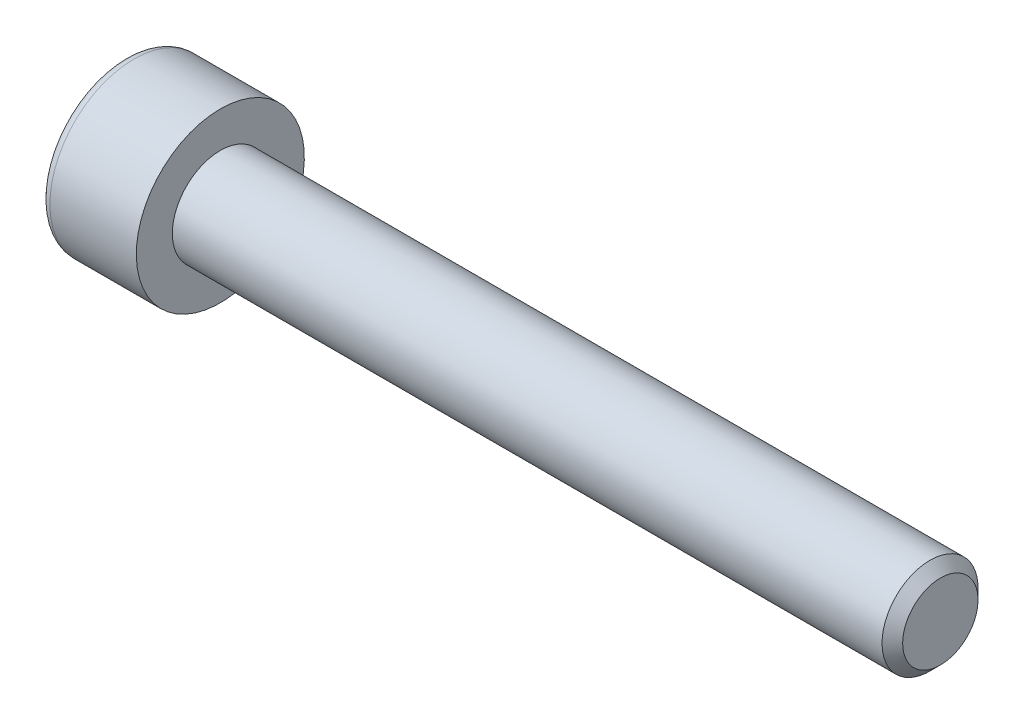
ISO-10303-21;
HEADER;
FILE_DESCRIPTION(('STEP AP214'),'2;1');
FILE_NAME('part.step','',(''),(''),'','','');
FILE_SCHEMA(('AUTOMOTIVE_DESIGN { 1 0 10303 214 1 1 1 1 }'));
ENDSEC;
DATA;
#1=APPLICATION_CONTEXT('core data for automotive mechanical design processes');
#2=APPLICATION_PROTOCOL_DEFINITION('international standard','automotive_design',2000,#1);
#3=PRODUCT_CONTEXT('',#1,'mechanical');
#4=PRODUCT('Part','Part','',(#3));
#5=PRODUCT_RELATED_PRODUCT_CATEGORY('part','',(#4));
#6=PRODUCT_DEFINITION_FORMATION('','',#4);
#7=PRODUCT_DEFINITION_CONTEXT('part definition',#1,'design');
#8=PRODUCT_DEFINITION('design','',#6,#7);
#9=PRODUCT_DEFINITION_SHAPE('','',#8);
#10=(LENGTH_UNIT() NAMED_UNIT(*) SI_UNIT(.MILLI.,.METRE.));
#11=(NAMED_UNIT(*) PLANE_ANGLE_UNIT() SI_UNIT($,.RADIAN.));
#12=(NAMED_UNIT(*) SI_UNIT($,.STERADIAN.) SOLID_ANGLE_UNIT());
#13=UNCERTAINTY_MEASURE_WITH_UNIT(LENGTH_MEASURE(1.E-05),#10,'distance_accuracy_value','');
#14=(GEOMETRIC_REPRESENTATION_CONTEXT(3) GLOBAL_UNCERTAINTY_ASSIGNED_CONTEXT((#13)) GLOBAL_UNIT_ASSIGNED_CONTEXT((#10,
#11,#12)) REPRESENTATION_CONTEXT('',''));
#15=CARTESIAN_POINT('',(0.,0.,0.));
#16=DIRECTION('',(0.,0.,1.));
#17=DIRECTION('',(1.,0.,0.));
#18=AXIS2_PLACEMENT_3D('',#15,#16,#17);
#19=CARTESIAN_POINT('',(-3.99999999999999,-1.5,0.866025403784439));
#20=DIRECTION('',(0.,-0.5,0.866025403784439));
#21=DIRECTION('',(0.,-0.866025403784439,-0.5));
#22=AXIS2_PLACEMENT_3D('',#19,#20,#21);
#23=PLANE('',#22);
#24=DIRECTION('',(1.,0.,0.));
#25=VECTOR('',#24,1.);
#26=CARTESIAN_POINT('',(-3.99999999999999,-1.5,0.866025403784438));
#27=LINE('',#26,#25);
#28=CARTESIAN_POINT('',(-1.99999998891168,-1.49999996234746,0.866025425523144));
#29=VERTEX_POINT('',#28);
#30=CARTESIAN_POINT('',(-3.99999999999999,-1.5,0.866025403784438));
#31=VERTEX_POINT('',#30);
#32=EDGE_CURVE('E80',#29,#31,#27,.F.);
#33=ORIENTED_EDGE('',*,*,#32,.T.);
#34=DIRECTION('',(0.,-0.866025403784439,-0.5));
#35=VECTOR('',#34,1.);
#36=CARTESIAN_POINT('',(-3.99999999999999,-1.5,0.866025403784439));
#37=LINE('',#36,#35);
#38=CARTESIAN_POINT('',(-3.99999999999999,0.,1.73205080756888));
#39=VERTEX_POINT('',#38);
#40=EDGE_CURVE('E92',#39,#31,#37,.T.);
#41=ORIENTED_EDGE('',*,*,#40,.F.);
#42=DIRECTION('',(1.,0.,0.));
#43=VECTOR('',#42,1.);
#44=CARTESIAN_POINT('',(-3.99999999999999,0.,1.73205080756888));
#45=LINE('',#44,#43);
#46=CARTESIAN_POINT('',(-1.99999999756033,1.17065811540061E-08,1.73205080081008));
#47=VERTEX_POINT('',#46);
#48=EDGE_CURVE('E75',#39,#47,#45,.T.);
#49=ORIENTED_EDGE('',*,*,#48,.T.);
#50=CARTESIAN_POINT('',(-2.00000000482552,-1.69656679672081E-08,1.7320507764364));
#51=CARTESIAN_POINT('',(-1.97802165673212,-0.0659159374495072,1.6939942156751));
#52=CARTESIAN_POINT('',(-1.95803350313014,-0.132400840657189,1.65560914452059));
#53=CARTESIAN_POINT('',(-1.92314478469149,-0.266521786309758,1.5781743845569));
#54=CARTESIAN_POINT('',(-1.90825656081386,-0.334160211041391,1.53912332031671));
#55=CARTESIAN_POINT('',(-1.88508196678765,-0.468598851910202,1.46150513374502));
#56=CARTESIAN_POINT('',(-1.87664133888713,-0.535378388718545,1.42294995058222));
#57=CARTESIAN_POINT('',(-1.86656687590437,-0.669251518015363,1.34565826362866));
#58=CARTESIAN_POINT('',(-1.86492469629748,-0.736344624245855,1.30692204057969));
#59=CARTESIAN_POINT('',(-1.86834972005003,-0.861700886720639,1.23454756862888));
#60=CARTESIAN_POINT('',(-1.87257596615346,-0.919982853717806,1.20089845931673));
#61=CARTESIAN_POINT('',(-1.88596797593476,-1.03616709971431,1.13381945363172));
#62=CARTESIAN_POINT('',(-1.8951383098147,-1.09406897716372,1.10038978909379));
#63=CARTESIAN_POINT('',(-1.91806236915501,-1.21049257364868,1.03317259431831));
#64=CARTESIAN_POINT('',(-1.93191322284809,-1.26899956514464,0.999393567029875));
#65=CARTESIAN_POINT('',(-1.96334880498841,-1.38514116894918,0.932339180811658));
#66=CARTESIAN_POINT('',(-1.98092615207156,-1.44277726801687,0.899062963501112));
#67=CARTESIAN_POINT('',(-1.99999997637403,-1.49999992473452,0.866025447238982));
#68=B_SPLINE_CURVE_WITH_KNOTS('',3,(#50,#51,#52,#53,#54,#55,#56,#57,#58,#59,#60,#61,#62,#63,#64,
#65,#66,#67),.UNSPECIFIED.,.F.,.F.,(4,2,2,2,2,2,2,2,4),(0.,0.237762010113592,0.476095365248652,
0.708530707821119,0.940680670780059,1.14278081102556,1.34506808914472,1.55184112923162,
1.75820836141962),.UNSPECIFIED.);
#69=EDGE_CURVE('E21',#47,#29,#68,.T.);
#70=ORIENTED_EDGE('',*,*,#69,.T.);
#71=EDGE_LOOP('',(#33,#41,#49,#70));
#72=FACE_BOUND('',#71,.T.);
#73=ADVANCED_FACE('F17',(#72),#23,.F.);
#74=CARTESIAN_POINT('',(-3.99999999999999,-1.5,-0.866025403784438));
#75=DIRECTION('',(0.,-1.,0.));
#76=DIRECTION('',(0.,0.,-1.));
#77=AXIS2_PLACEMENT_3D('',#74,#75,#76);
#78=PLANE('',#77);
#79=DIRECTION('',(1.,0.,0.));
#80=VECTOR('',#79,1.);
#81=CARTESIAN_POINT('',(-3.99999999999999,-1.5,-0.866025403784438));
#82=LINE('',#81,#80);
#83=CARTESIAN_POINT('',(-1.99999998891168,-1.5,-0.866025360307029));
#84=VERTEX_POINT('',#83);
#85=CARTESIAN_POINT('',(-3.99999999999999,-1.5,-0.866025403784438));
#86=VERTEX_POINT('',#85);
#87=EDGE_CURVE('E228',#84,#86,#82,.F.);
#88=ORIENTED_EDGE('',*,*,#87,.T.);
#89=DIRECTION('',(0.,0.,-1.));
#90=VECTOR('',#89,1.);
#91=CARTESIAN_POINT('',(-3.99999999999999,-1.5,-0.866025403784438));
#92=LINE('',#91,#90);
#93=EDGE_CURVE('E91',#31,#86,#92,.T.);
#94=ORIENTED_EDGE('',*,*,#93,.F.);
#95=ORIENTED_EDGE('',*,*,#32,.F.);
#96=CARTESIAN_POINT('',(-2.00000003345661,-1.49999996279314,0.86602543023194));
#97=CARTESIAN_POINT('',(-1.97802167633596,-1.49999998663696,0.789912288043619));
#98=CARTESIAN_POINT('',(-1.95803351798676,-1.49999999641848,0.713142136025852));
#99=CARTESIAN_POINT('',(-1.92314479392352,-1.50000000359013,0.558272606351827));
#100=CARTESIAN_POINT('',(-1.90825656917179,-1.50000000095042,0.480170477857981));
#101=CARTESIAN_POINT('',(-1.88508197259174,-1.4999999990731,0.324934102225646));
#102=CARTESIAN_POINT('',(-1.87664134301156,-1.49999999975292,0.247823733495601));
#103=CARTESIAN_POINT('',(-1.86656687719771,-1.50000000024678,0.0932403552902461));
#104=CARTESIAN_POINT('',(-1.86492469644222,-1.50000000006188,0.0157679072976017));
#105=CARTESIAN_POINT('',(-1.86834971837683,-1.49999999994613,-0.128981041441009));
#106=CARTESIAN_POINT('',(-1.87257596385187,-1.49999999998548,-0.196279262971685));
#107=CARTESIAN_POINT('',(-1.88596797287087,-1.50000000001453,-0.330437280097107));
#108=CARTESIAN_POINT('',(-1.89513830661581,-1.50000000000419,-0.397296612022104));
#109=CARTESIAN_POINT('',(-1.91806236614554,-1.49999999999572,-0.531731007509723));
#110=CARTESIAN_POINT('',(-1.93191322018681,-1.49999999999786,-0.599289065170726));
#111=CARTESIAN_POINT('',(-1.9633488034,-1.50000000000214,-0.733397843721906));
#112=CARTESIAN_POINT('',(-1.98092615120869,-1.50000000000427,-0.799950281373398));
#113=CARTESIAN_POINT('',(-1.99999997637403,-1.5,-0.866025316875355));
#114=B_SPLINE_CURVE_WITH_KNOTS('',3,(#96,#97,#98,#99,#100,#101,#102,#103,#104,#105,#106,#107,
#108,#109,#110,#111,#112,#113),.UNSPECIFIED.,.F.,.F.,(4,2,2,2,2,2,2,2,4),(0.,0.237762017435471,
0.476095379632392,0.708530728262795,0.940680697391252,1.14278084610199,1.34506813263122,
1.55184118196909,1.75820842347644),.UNSPECIFIED.);
#115=EDGE_CURVE('E85',#29,#84,#114,.T.);
#116=ORIENTED_EDGE('',*,*,#115,.T.);
#117=EDGE_LOOP('',(#88,#94,#95,#116));
#118=FACE_BOUND('',#117,.T.);
#119=ADVANCED_FACE('F89',(#118),#78,.F.);
#120=CARTESIAN_POINT('',(-3.99999999999999,0.,1.73205080756888));
#121=DIRECTION('',(0.,0.500000000000001,0.866025403784438));
#122=DIRECTION('',(0.,-0.866025403784438,0.500000000000001));
#123=AXIS2_PLACEMENT_3D('',#120,#121,#122);
#124=PLANE('',#123);
#125=ORIENTED_EDGE('',*,*,#48,.F.);
#126=DIRECTION('',(0.,-0.866025403784438,0.500000000000001));
#127=VECTOR('',#126,1.);
#128=CARTESIAN_POINT('',(-3.99999999999999,0.,1.73205080756888));
#129=LINE('',#128,#127);
#130=CARTESIAN_POINT('',(-3.99999999999999,1.5,0.866025403784437));
#131=VERTEX_POINT('',#130);
#132=EDGE_CURVE('E236',#131,#39,#129,.T.);
#133=ORIENTED_EDGE('',*,*,#132,.F.);
#134=DIRECTION('',(1.,0.,0.));
#135=VECTOR('',#134,1.);
#136=CARTESIAN_POINT('',(-3.99999999999999,1.5,0.866025403784437));
#137=LINE('',#136,#135);
#138=CARTESIAN_POINT('',(-1.99999998890538,1.5,0.866025360285225));
#139=VERTEX_POINT('',#138);
#140=EDGE_CURVE('E86',#131,#139,#137,.T.);
#141=ORIENTED_EDGE('',*,*,#140,.T.);
#142=CARTESIAN_POINT('',(-2.00000003346821,1.50000000427593,0.866025358324988));
#143=CARTESIAN_POINT('',(-1.9780216763327,1.43408410149372,0.904081950090565));
#144=CARTESIAN_POINT('',(-1.95803351797519,1.36759920447148,0.942467034585473));
#145=CARTESIAN_POINT('',(-1.92314479390271,1.23347826105346,1.01990180565832));
#146=CARTESIAN_POINT('',(-1.90825656915023,1.16583983234749,1.05895286762923));
#147=CARTESIAN_POINT('',(-1.88508197257779,1.03140118651456,1.13657105382121));
#148=CARTESIAN_POINT('',(-1.87664134300272,0.964621648655026,1.17512623876626));
#149=CARTESIAN_POINT('',(-1.86656687719568,0.830748516407823,1.25241792827708));
#150=CARTESIAN_POINT('',(-1.86492469644174,0.76365540827894,1.29115415210242));
#151=CARTESIAN_POINT('',(-1.86834971849238,0.638299137296413,1.36352862876504));
#152=CARTESIAN_POINT('',(-1.87257596445895,0.580017163685439,1.39717774196371));
#153=CARTESIAN_POINT('',(-1.88596797513641,0.463832904505954,1.46425675531015));
#154=CARTESIAN_POINT('',(-1.89513831004988,0.405931020487366,1.49768642362292));
#155=CARTESIAN_POINT('',(-1.91806237249297,0.289507410581117,1.56490362613253));
#156=CARTESIAN_POINT('',(-1.93191322830016,0.231000412240471,1.59868265737645));
#157=CARTESIAN_POINT('',(-1.9633488154291,0.114858794944813,1.66573705139116));
#158=CARTESIAN_POINT('',(-1.98092616538529,0.0572226892303414,1.69901327254292));
#159=CARTESIAN_POINT('',(-1.99999999280971,2.59584334250394E-08,1.73205079258177));
#160=B_SPLINE_CURVE_WITH_KNOTS('',3,(#142,#143,#144,#145,#146,#147,#148,#149,#150,#151,#152,
#153,#154,#155,#156,#157,#158,#159),.UNSPECIFIED.,.F.,.F.,(4,2,2,2,2,2,2,2,4),(0.,
0.237762017496603,0.476095379761564,0.708530728335652,0.940680697402626,1.14278086052927,
1.34506816152763,1.55184122608649,1.75820848269909),.UNSPECIFIED.);
#161=EDGE_CURVE('E122',#139,#47,#160,.T.);
#162=ORIENTED_EDGE('',*,*,#161,.T.);
#163=EDGE_LOOP('',(#125,#133,#141,#162));
#164=FACE_BOUND('',#163,.T.);
#165=ADVANCED_FACE('F115',(#164),#124,.F.);
#166=CARTESIAN_POINT('',(-3.99999999999999,0.,-1.73205080756888));
#167=DIRECTION('',(0.,-0.5,-0.866025403784439));
#168=DIRECTION('',(0.,0.866025403784439,-0.5));
#169=AXIS2_PLACEMENT_3D('',#166,#167,#168);
#170=PLANE('',#169);
#171=DIRECTION('',(1.,0.,0.));
#172=VECTOR('',#171,1.);
#173=CARTESIAN_POINT('',(-3.99999999999999,0.,-1.73205080756888));
#174=LINE('',#173,#172);
#175=CARTESIAN_POINT('',(-1.99999999366365,-5.19138655637551E-08,-1.73205079406084));
#176=VERTEX_POINT('',#175);
#177=CARTESIAN_POINT('',(-3.99999999999999,0.,-1.73205080756888));
#178=VERTEX_POINT('',#177);
#179=EDGE_CURVE('E127',#176,#178,#174,.F.);
#180=ORIENTED_EDGE('',*,*,#179,.T.);
#181=DIRECTION('',(0.,0.866025403784439,-0.5));
#182=VECTOR('',#181,1.);
#183=CARTESIAN_POINT('',(-3.99999999999999,0.,-1.73205080756888));
#184=LINE('',#183,#182);
#185=EDGE_CURVE('E40',#86,#178,#184,.T.);
#186=ORIENTED_EDGE('',*,*,#185,.F.);
#187=ORIENTED_EDGE('',*,*,#87,.F.);
#188=CARTESIAN_POINT('',(-2.00000003345661,-1.50000000430078,-0.8660253583386));
#189=CARTESIAN_POINT('',(-1.97802167633596,-1.43408410152575,-0.904081950082118));
#190=CARTESIAN_POINT('',(-1.95803351798677,-1.36759920451673,-0.942467034562044));
#191=CARTESIAN_POINT('',(-1.92314479392352,-1.2334782611327,-1.01990180560988));
#192=CARTESIAN_POINT('',(-1.90825656917179,-1.16583983244754,-1.05895286757075));
#193=CARTESIAN_POINT('',(-1.88508197259174,-1.03140118661986,-1.13657105376111));
#194=CARTESIAN_POINT('',(-1.87664134301156,-0.964621648744363,-1.17512623871487));
#195=CARTESIAN_POINT('',(-1.86656687719771,-0.830748516462633,-1.25241792824525));
#196=CARTESIAN_POINT('',(-1.86492469644222,-0.763655408315185,-1.29115415208145));
#197=CARTESIAN_POINT('',(-1.86834971837682,-0.638299141479103,-1.3635286263502));
#198=CARTESIAN_POINT('',(-1.8725759638518,-0.580017172024226,-1.39717773714932));
#199=CARTESIAN_POINT('',(-1.88596797287059,-0.463832921087834,-1.46425674573659));
#200=CARTESIAN_POINT('',(-1.89513830661538,-0.405931041156076,-1.49768641168983));
#201=CARTESIAN_POINT('',(-1.91806236614474,-0.289507439518203,-1.5649036094257));
#202=CARTESIAN_POINT('',(-1.93191322018578,-0.23100044535504,-1.59868263825775));
#203=CARTESIAN_POINT('',(-1.96334880339847,-0.114858836262392,-1.66573702753644));
#204=CARTESIAN_POINT('',(-1.9809261512069,-0.0572227345739954,-1.69901324636374));
#205=CARTESIAN_POINT('',(-1.99999997637195,-7.52717105300198E-08,-1.73205076411073));
#206=B_SPLINE_CURVE_WITH_KNOTS('',3,(#188,#189,#190,#191,#192,#193,#194,#195,#196,#197,#198,
#199,#200,#201,#202,#203,#204,#205),.UNSPECIFIED.,.F.,.F.,(4,2,2,2,2,2,2,2,4),(0.,
0.237762017435464,0.476095379632376,0.708530728262786,0.940680697391252,1.14278084610016,
1.34506813262756,1.55184118196351,1.75820842346894),.UNSPECIFIED.);
#207=EDGE_CURVE('E98',#84,#176,#206,.T.);
#208=ORIENTED_EDGE('',*,*,#207,.T.);
#209=EDGE_LOOP('',(#180,#186,#187,#208));
#210=FACE_BOUND('',#209,.T.);
#211=ADVANCED_FACE('F118',(#210),#170,.F.);
#212=CARTESIAN_POINT('',(-3.99999999999999,1.5,0.866025403784437));
#213=DIRECTION('',(0.,1.,0.));
#214=DIRECTION('',(0.,0.,1.));
#215=AXIS2_PLACEMENT_3D('',#212,#213,#214);
#216=PLANE('',#215);
#217=ORIENTED_EDGE('',*,*,#140,.F.);
#218=DIRECTION('',(0.,0.,1.));
#219=VECTOR('',#218,1.);
#220=CARTESIAN_POINT('',(-3.99999999999999,1.5,0.866025403784437));
#221=LINE('',#220,#219);
#222=CARTESIAN_POINT('',(-3.99999999999999,1.5,-0.866025403784439));
#223=VERTEX_POINT('',#222);
#224=EDGE_CURVE('E218',#223,#131,#221,.T.);
#225=ORIENTED_EDGE('',*,*,#224,.F.);
#226=DIRECTION('',(1.,0.,0.));
#227=VECTOR('',#226,1.);
#228=CARTESIAN_POINT('',(-3.99999999999999,1.5,-0.866025403784439));
#229=LINE('',#228,#227);
#230=CARTESIAN_POINT('',(-2.00000000140742,1.5,-0.866025403593545));
#231=VERTEX_POINT('',#230);
#232=EDGE_CURVE('E205',#223,#231,#229,.T.);
#233=ORIENTED_EDGE('',*,*,#232,.T.);
#234=CARTESIAN_POINT('',(-2.0000000011856,1.50000000027587,-0.866025403450778));
#235=CARTESIAN_POINT('',(-1.9780216600842,1.50000000009908,-0.789912260137247));
#236=CARTESIAN_POINT('',(-1.95803350905901,1.50000000002656,-0.713142109266175));
#237=CARTESIAN_POINT('',(-1.92314479173039,1.49999999997338,-0.558272583723485));
#238=CARTESIAN_POINT('',(-1.90825656638533,1.49999999999295,-0.48017045821589));
#239=CARTESIAN_POINT('',(-1.88508197026967,1.50000000000687,-0.324934087629145));
#240=CARTESIAN_POINT('',(-1.87664134173787,1.50000000000183,-0.247823720964153));
#241=CARTESIAN_POINT('',(-1.86656687712453,1.49999999999817,-0.0932403471728983));
#242=CARTESIAN_POINT('',(-1.86492469651386,1.49999999999954,-0.0157679015296353));
#243=CARTESIAN_POINT('',(-1.86834971851033,1.5000000000004,0.128981044688144));
#244=CARTESIAN_POINT('',(-1.87257596407841,1.50000000000011,0.196279266038497));
#245=CARTESIAN_POINT('',(-1.88596797322546,1.49999999999989,0.330437282850767));
#246=CARTESIAN_POINT('',(-1.8951383070096,1.49999999999997,0.397296614642493));
#247=CARTESIAN_POINT('',(-1.91806236655738,1.50000000000003,0.531731009606254));
#248=CARTESIAN_POINT('',(-1.93191322055998,1.50000000000002,0.59928906687973));
#249=CARTESIAN_POINT('',(-1.96334880362966,1.49999999999999,0.733397844584877));
#250=CARTESIAN_POINT('',(-1.98092615132905,1.49999999999997,0.7999502817789));
#251=CARTESIAN_POINT('',(-1.99999997636081,1.5,0.866025316829545));
#252=B_SPLINE_CURVE_WITH_KNOTS('',3,(#234,#235,#236,#237,#238,#239,#240,#241,#242,#243,#244,
#245,#246,#247,#248,#249,#250,#251),.UNSPECIFIED.,.F.,.F.,(4,2,2,2,2,2,2,2,4),(0.,
0.237762008630601,0.476095362694365,0.708530704659326,0.940680666842419,1.14278081500847,
1.34506810116673,1.55184114934296,1.75820838944098),.UNSPECIFIED.);
#253=EDGE_CURVE('E99',#231,#139,#252,.T.);
#254=ORIENTED_EDGE('',*,*,#253,.T.);
#255=EDGE_LOOP('',(#217,#225,#233,#254));
#256=FACE_BOUND('',#255,.T.);
#257=ADVANCED_FACE('F137',(#256),#216,.F.);
#258=CARTESIAN_POINT('',(-2.00600000107443,0.,0.));
#259=DIRECTION('',(-1.,0.,0.));
#260=DIRECTION('',(0.,0.,1.));
#261=AXIS2_PLACEMENT_3D('',#258,#259,#260);
#262=CONICAL_SURFACE('',#261,1.74244311170924,1.04719754982784);
#263=CARTESIAN_POINT('',(-0.999999998555268,-2.27373675443232E-10,0.));
#264=VERTEX_POINT('',#263);
#265=VERTEX_LOOP('',#264);
#266=FACE_BOUND('',#265,.T.);
#267=ORIENTED_EDGE('',*,*,#253,.F.);
#268=CARTESIAN_POINT('',(-2.00000000118559,1.49999999984897,-0.866025404190178));
#269=CARTESIAN_POINT('',(-1.97802166007364,1.4340840840571,-0.904081975712357));
#270=CARTESIAN_POINT('',(-1.95803350903967,1.36759918308166,-0.942467051103831));
#271=CARTESIAN_POINT('',(-1.92314479169794,1.23347823959304,-1.01990181386955));
#272=CARTESIAN_POINT('',(-1.90825656634887,1.16583981478608,-1.05895287666201));
#273=CARTESIAN_POINT('',(-1.88508197024561,1.03140117426796,-1.13657106197071));
#274=CARTESIAN_POINT('',(-1.8766413417237,0.964621637871239,-1.17512624527989));
#275=CARTESIAN_POINT('',(-1.86656687712225,0.830748509235063,-1.25241793213102));
#276=CARTESIAN_POINT('',(-1.86492469651326,0.763655403254154,-1.29115415493145));
#277=CARTESIAN_POINT('',(-1.86834971873942,0.638299130358346,-1.36352863283344));
#278=CARTESIAN_POINT('',(-1.87257596529064,0.580017152717777,-1.39717774831279));
#279=CARTESIAN_POINT('',(-1.88596797775652,0.463832885532158,-1.46425676624776));
#280=CARTESIAN_POINT('',(-1.89513831387957,0.405930997537601,-1.49768643686809));
#281=CARTESIAN_POINT('',(-1.91806237925927,0.289507379801399,-1.56490364390819));
#282=CARTESIAN_POINT('',(-1.93191323679713,0.231000377608044,-1.59868267737399));
#283=CARTESIAN_POINT('',(-1.96334882770619,0.114858752820833,-1.66573707570897));
#284=CARTESIAN_POINT('',(-1.98092617970503,0.0572226434660671,-1.69901329895996));
#285=CARTESIAN_POINT('',(-2.00000000925974,-2.33916513795793E-08,-1.73205082107405));
#286=B_SPLINE_CURVE_WITH_KNOTS('',3,(#268,#269,#270,#271,#272,#273,#274,#275,#276,#277,#278,
#279,#280,#281,#282,#283,#284,#285),.UNSPECIFIED.,.F.,.F.,(4,2,2,2,2,2,2,2,4),(0.,
0.237762008745907,0.476095362939784,0.708530704787438,0.940680666842473,1.14278084387596,
1.34506815900847,1.55184123766355,1.75820850800835),.UNSPECIFIED.);
#287=EDGE_CURVE('E128',#231,#176,#286,.T.);
#288=ORIENTED_EDGE('',*,*,#287,.T.);
#289=ORIENTED_EDGE('',*,*,#207,.F.);
#290=ORIENTED_EDGE('',*,*,#115,.F.);
#291=ORIENTED_EDGE('',*,*,#69,.F.);
#292=ORIENTED_EDGE('',*,*,#161,.F.);
#293=EDGE_LOOP('',(#267,#288,#289,#290,#291,#292));
#294=FACE_BOUND('',#293,.T.);
#295=ADVANCED_FACE('F96',(#266,#294),#262,.F.);
#296=CARTESIAN_POINT('',(-3.99999999999999,1.5,-0.866025403784439));
#297=DIRECTION('',(0.,0.5,-0.866025403784439));
#298=DIRECTION('',(0.,0.866025403784439,0.5));
#299=AXIS2_PLACEMENT_3D('',#296,#297,#298);
#300=PLANE('',#299);
#301=ORIENTED_EDGE('',*,*,#232,.F.);
#302=DIRECTION('',(0.,0.866025403784439,0.5));
#303=VECTOR('',#302,1.);
#304=CARTESIAN_POINT('',(-3.99999999999999,0.,-1.73205080756888));
#305=LINE('',#304,#303);
#306=EDGE_CURVE('E224',#178,#223,#305,.T.);
#307=ORIENTED_EDGE('',*,*,#306,.F.);
#308=ORIENTED_EDGE('',*,*,#179,.F.);
#309=ORIENTED_EDGE('',*,*,#287,.F.);
#310=EDGE_LOOP('',(#301,#307,#308,#309));
#311=FACE_BOUND('',#310,.T.);
#312=ADVANCED_FACE('F146',(#311),#300,.F.);
#313=CARTESIAN_POINT('',(-3.99999999999999,2.61602540378444,0.));
#314=DIRECTION('',(-1.,0.,0.));
#315=DIRECTION('',(0.,0.,1.));
#316=AXIS2_PLACEMENT_3D('',#313,#314,#315);
#317=PLANE('',#316);
#318=ORIENTED_EDGE('',*,*,#185,.T.);
#319=ORIENTED_EDGE('',*,*,#306,.T.);
#320=ORIENTED_EDGE('',*,*,#224,.T.);
#321=ORIENTED_EDGE('',*,*,#132,.T.);
#322=ORIENTED_EDGE('',*,*,#40,.T.);
#323=ORIENTED_EDGE('',*,*,#93,.T.);
#324=EDGE_LOOP('',(#318,#319,#320,#321,#322,#323));
#325=FACE_BOUND('',#324,.T.);
#326=CARTESIAN_POINT('',(-3.99999999999999,0.,0.));
#327=DIRECTION('',(1.,0.,0.));
#328=DIRECTION('',(0.,1.,0.));
#329=AXIS2_PLACEMENT_3D('',#326,#327,#328);
#330=CIRCLE('',#329,3.1);
#331=CARTESIAN_POINT('',(-3.99999999999999,3.1,0.));
#332=VERTEX_POINT('',#331);
#333=EDGE_CURVE('E192',#332,#332,#330,.T.);
#334=ORIENTED_EDGE('',*,*,#333,.F.);
#335=EDGE_LOOP('',(#334));
#336=FACE_BOUND('',#335,.T.);
#337=ADVANCED_FACE('F179',(#325,#336),#317,.T.);
#338=CARTESIAN_POINT('',(-3.59999999999999,0.,0.));
#339=DIRECTION('',(1.,0.,0.));
#340=DIRECTION('',(0.,0.,-1.));
#341=AXIS2_PLACEMENT_3D('',#338,#339,#340);
#342=TOROIDAL_SURFACE('',#341,3.1,0.4);
#343=CARTESIAN_POINT('',(-3.59999999999999,0.,0.));
#344=DIRECTION('',(1.,0.,0.));
#345=DIRECTION('',(0.,1.,0.));
#346=AXIS2_PLACEMENT_3D('',#343,#344,#345);
#347=CIRCLE('',#346,3.5);
#348=CARTESIAN_POINT('',(-3.59999999999999,3.5,0.));
#349=VERTEX_POINT('',#348);
#350=EDGE_CURVE('E256',#349,#349,#347,.T.);
#351=ORIENTED_EDGE('',*,*,#350,.F.);
#352=EDGE_LOOP('',(#351));
#353=FACE_BOUND('',#352,.T.);
#354=ORIENTED_EDGE('',*,*,#333,.T.);
#355=EDGE_LOOP('',(#354));
#356=FACE_BOUND('',#355,.T.);
#357=ADVANCED_FACE('F173',(#353,#356),#342,.T.);
#358=CARTESIAN_POINT('',(-2.,0.,0.));
#359=DIRECTION('',(1.,0.,0.));
#360=DIRECTION('',(0.,1.,0.));
#361=AXIS2_PLACEMENT_3D('',#358,#359,#360);
#362=CYLINDRICAL_SURFACE('',#361,3.5);
#363=ORIENTED_EDGE('',*,*,#350,.T.);
#364=EDGE_LOOP('',(#363));
#365=FACE_BOUND('',#364,.T.);
#366=CARTESIAN_POINT('',(0.,0.,0.));
#367=DIRECTION('',(1.,0.,0.));
#368=DIRECTION('',(0.,1.,0.));
#369=AXIS2_PLACEMENT_3D('',#366,#367,#368);
#370=CIRCLE('',#369,3.5);
#371=CARTESIAN_POINT('',(0.,3.5,0.));
#372=VERTEX_POINT('',#371);
#373=EDGE_CURVE('E254',#372,#372,#370,.T.);
#374=ORIENTED_EDGE('',*,*,#373,.F.);
#375=EDGE_LOOP('',(#374));
#376=FACE_BOUND('',#375,.T.);
#377=ADVANCED_FACE('F169',(#365,#376),#362,.T.);
#378=CARTESIAN_POINT('',(30.,1.,0.));
#379=DIRECTION('',(1.,0.,0.));
#380=DIRECTION('',(0.,0.,-1.));
#381=AXIS2_PLACEMENT_3D('',#378,#379,#380);
#382=PLANE('',#381);
#383=CARTESIAN_POINT('',(30.0000000002569,0.,0.));
#384=DIRECTION('',(-1.,0.,0.));
#385=DIRECTION('',(0.,0.,1.));
#386=AXIS2_PLACEMENT_3D('',#383,#384,#385);
#387=CIRCLE('',#386,1.57058500013818);
#388=CARTESIAN_POINT('',(30.0000000002569,0.,1.57058500013818));
#389=VERTEX_POINT('',#388);
#390=EDGE_CURVE('E252',#389,#389,#387,.T.);
#391=ORIENTED_EDGE('',*,*,#390,.F.);
#392=EDGE_LOOP('',(#391));
#393=FACE_BOUND('',#392,.T.);
#394=ADVANCED_FACE('F165',(#393),#382,.T.);
#395=CARTESIAN_POINT('',(0.,2.75,0.));
#396=DIRECTION('',(1.,0.,0.));
#397=DIRECTION('',(0.,0.,-1.));
#398=AXIS2_PLACEMENT_3D('',#395,#396,#397);
#399=PLANE('',#398);
#400=CARTESIAN_POINT('',(0.,0.,0.));
#401=DIRECTION('',(1.,0.,0.));
#402=DIRECTION('',(0.,1.,0.));
#403=AXIS2_PLACEMENT_3D('',#400,#401,#402);
#404=CIRCLE('',#403,2.);
#405=CARTESIAN_POINT('',(0.,2.,0.));
#406=VERTEX_POINT('',#405);
#407=EDGE_CURVE('E31',#406,#406,#404,.T.);
#408=ORIENTED_EDGE('',*,*,#407,.F.);
#409=EDGE_LOOP('',(#408));
#410=FACE_BOUND('',#409,.T.);
#411=ORIENTED_EDGE('',*,*,#373,.T.);
#412=EDGE_LOOP('',(#411));
#413=FACE_BOUND('',#412,.T.);
#414=ADVANCED_FACE('F158',(#410,#413),#399,.T.);
#415=CARTESIAN_POINT('',(29.570584999874,0.,0.));
#416=DIRECTION('',(-1.,0.,0.));
#417=DIRECTION('',(0.,0.,1.));
#418=AXIS2_PLACEMENT_3D('',#415,#416,#417);
#419=CONICAL_SURFACE('',#418,1.99999999972533,0.78539816247083);
#420=ORIENTED_EDGE('',*,*,#390,.T.);
#421=EDGE_LOOP('',(#420));
#422=FACE_BOUND('',#421,.T.);
#423=CARTESIAN_POINT('',(29.570585,0.,0.));
#424=DIRECTION('',(1.,0.,0.));
#425=DIRECTION('',(0.,1.,0.));
#426=AXIS2_PLACEMENT_3D('',#423,#424,#425);
#427=CIRCLE('',#426,2.);
#428=CARTESIAN_POINT('',(29.570585,2.,0.));
#429=VERTEX_POINT('',#428);
#430=EDGE_CURVE('E11',#429,#429,#427,.F.);
#431=ORIENTED_EDGE('',*,*,#430,.F.);
#432=EDGE_LOOP('',(#431));
#433=FACE_BOUND('',#432,.T.);
#434=ADVANCED_FACE('F152',(#422,#433),#419,.T.);
#435=CARTESIAN_POINT('',(18.375,0.,0.));
#436=DIRECTION('',(1.,0.,0.));
#437=DIRECTION('',(0.,1.,0.));
#438=AXIS2_PLACEMENT_3D('',#435,#436,#437);
#439=CYLINDRICAL_SURFACE('',#438,2.);
#440=ORIENTED_EDGE('',*,*,#430,.T.);
#441=EDGE_LOOP('',(#440));
#442=FACE_BOUND('',#441,.T.);
#443=ORIENTED_EDGE('',*,*,#407,.T.);
#444=EDGE_LOOP('',(#443));
#445=FACE_BOUND('',#444,.T.);
#446=ADVANCED_FACE('F150',(#442,#445),#439,.T.);
#447=CLOSED_SHELL('',(#73,#119,#165,#211,#257,#295,#312,#337,#357,#377,#394,#414,#434,#446));
#448=MANIFOLD_SOLID_BREP('B1',#447);
#449=ADVANCED_BREP_SHAPE_REPRESENTATION('',(#18,#448),#14);
#450=SHAPE_DEFINITION_REPRESENTATION(#9,#449);
ENDSEC;
END-ISO-10303-21;
